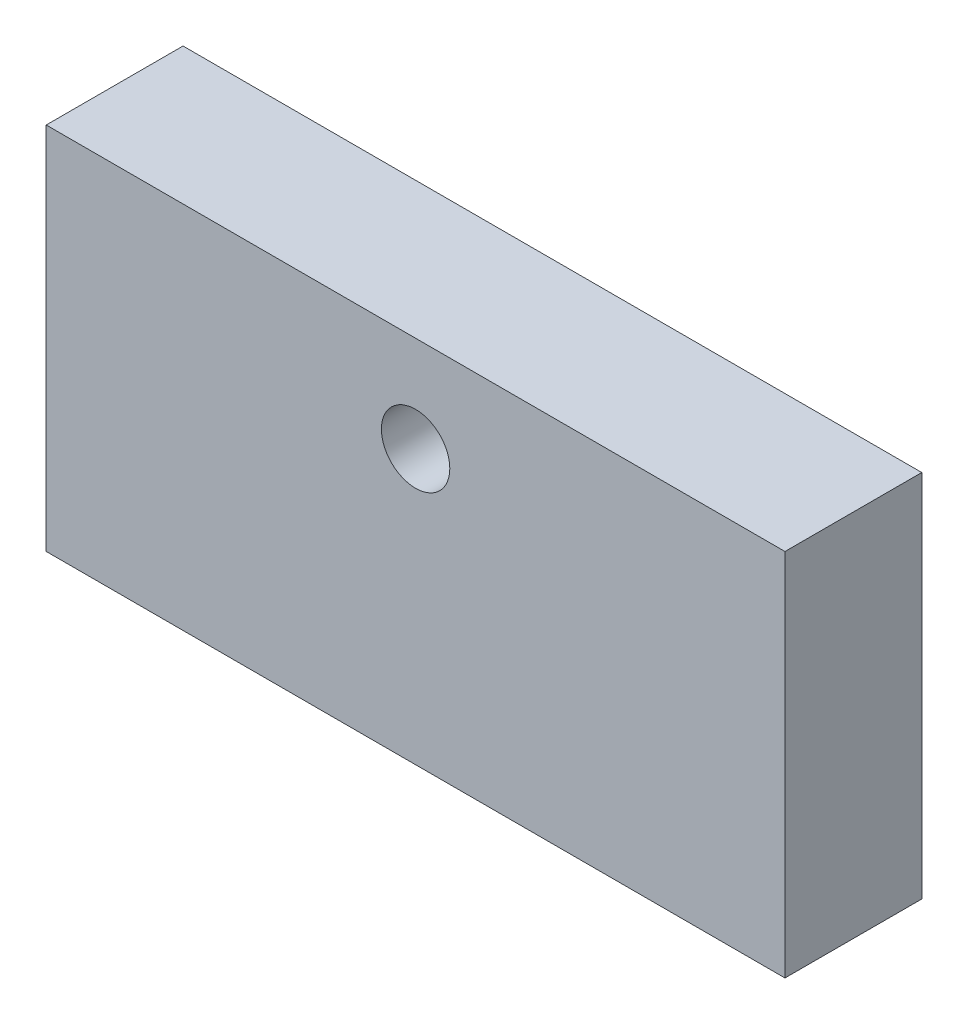
ISO-10303-21;
HEADER;
FILE_DESCRIPTION(('STEP AP214'),'2;1');
FILE_NAME('part.step','',(''),(''),'','','');
FILE_SCHEMA(('AUTOMOTIVE_DESIGN { 1 0 10303 214 1 1 1 1 }'));
ENDSEC;
DATA;
#1=APPLICATION_CONTEXT('core data for automotive mechanical design processes');
#2=APPLICATION_PROTOCOL_DEFINITION('international standard','automotive_design',2000,#1);
#3=PRODUCT_CONTEXT('',#1,'mechanical');
#4=PRODUCT('Part','Part','',(#3));
#5=PRODUCT_RELATED_PRODUCT_CATEGORY('part','',(#4));
#6=PRODUCT_DEFINITION_FORMATION('','',#4);
#7=PRODUCT_DEFINITION_CONTEXT('part definition',#1,'design');
#8=PRODUCT_DEFINITION('design','',#6,#7);
#9=PRODUCT_DEFINITION_SHAPE('','',#8);
#10=(LENGTH_UNIT() NAMED_UNIT(*) SI_UNIT(.MILLI.,.METRE.));
#11=(NAMED_UNIT(*) PLANE_ANGLE_UNIT() SI_UNIT($,.RADIAN.));
#12=(NAMED_UNIT(*) SI_UNIT($,.STERADIAN.) SOLID_ANGLE_UNIT());
#13=UNCERTAINTY_MEASURE_WITH_UNIT(LENGTH_MEASURE(1.E-05),#10,'distance_accuracy_value','');
#14=(GEOMETRIC_REPRESENTATION_CONTEXT(3) GLOBAL_UNCERTAINTY_ASSIGNED_CONTEXT((#13)) GLOBAL_UNIT_ASSIGNED_CONTEXT((#10,
#11,#12)) REPRESENTATION_CONTEXT('',''));
#15=CARTESIAN_POINT('',(0.,0.,0.));
#16=DIRECTION('',(0.,0.,1.));
#17=DIRECTION('',(1.,0.,0.));
#18=AXIS2_PLACEMENT_3D('',#15,#16,#17);
#19=CARTESIAN_POINT('',(0.,0.,10.));
#20=DIRECTION('',(1.,0.,0.));
#21=DIRECTION('',(0.,0.,-1.));
#22=AXIS2_PLACEMENT_3D('',#19,#20,#21);
#23=PLANE('',#22);
#24=DIRECTION('',(0.,-1.,0.));
#25=VECTOR('',#24,1.);
#26=CARTESIAN_POINT('',(0.,0.,0.));
#27=LINE('',#26,#25);
#28=CARTESIAN_POINT('',(0.,27.,0.));
#29=VERTEX_POINT('',#28);
#30=CARTESIAN_POINT('',(0.,0.,0.));
#31=VERTEX_POINT('',#30);
#32=EDGE_CURVE('E96',#29,#31,#27,.T.);
#33=ORIENTED_EDGE('',*,*,#32,.T.);
#34=DIRECTION('',(0.,0.,-1.));
#35=VECTOR('',#34,1.);
#36=CARTESIAN_POINT('',(0.,0.,10.));
#37=LINE('',#36,#35);
#38=CARTESIAN_POINT('',(0.,0.,10.));
#39=VERTEX_POINT('',#38);
#40=EDGE_CURVE('E11',#39,#31,#37,.T.);
#41=ORIENTED_EDGE('',*,*,#40,.F.);
#42=DIRECTION('',(0.,-1.,0.));
#43=VECTOR('',#42,1.);
#44=CARTESIAN_POINT('',(0.,0.,10.));
#45=LINE('',#44,#43);
#46=CARTESIAN_POINT('',(0.,27.,10.));
#47=VERTEX_POINT('',#46);
#48=EDGE_CURVE('E84',#47,#39,#45,.T.);
#49=ORIENTED_EDGE('',*,*,#48,.F.);
#50=DIRECTION('',(0.,0.,-1.));
#51=VECTOR('',#50,1.);
#52=CARTESIAN_POINT('',(0.,27.,10.));
#53=LINE('',#52,#51);
#54=EDGE_CURVE('E92',#47,#29,#53,.T.);
#55=ORIENTED_EDGE('',*,*,#54,.T.);
#56=EDGE_LOOP('',(#33,#41,#49,#55));
#57=FACE_BOUND('',#56,.T.);
#58=ADVANCED_FACE('F33',(#57),#23,.F.);
#59=CARTESIAN_POINT('',(0.,0.,10.));
#60=DIRECTION('',(0.,1.,0.));
#61=DIRECTION('',(0.,0.,1.));
#62=AXIS2_PLACEMENT_3D('',#59,#60,#61);
#63=PLANE('',#62);
#64=DIRECTION('',(1.,0.,0.));
#65=VECTOR('',#64,1.);
#66=CARTESIAN_POINT('',(0.,0.,0.));
#67=LINE('',#66,#65);
#68=CARTESIAN_POINT('',(54.,0.,0.));
#69=VERTEX_POINT('',#68);
#70=EDGE_CURVE('E88',#31,#69,#67,.T.);
#71=ORIENTED_EDGE('',*,*,#70,.T.);
#72=DIRECTION('',(0.,0.,-1.));
#73=VECTOR('',#72,1.);
#74=CARTESIAN_POINT('',(54.,0.,10.));
#75=LINE('',#74,#73);
#76=CARTESIAN_POINT('',(54.,0.,10.));
#77=VERTEX_POINT('',#76);
#78=EDGE_CURVE('E41',#77,#69,#75,.T.);
#79=ORIENTED_EDGE('',*,*,#78,.F.);
#80=DIRECTION('',(1.,0.,0.));
#81=VECTOR('',#80,1.);
#82=CARTESIAN_POINT('',(0.,0.,10.));
#83=LINE('',#82,#81);
#84=EDGE_CURVE('E79',#39,#77,#83,.T.);
#85=ORIENTED_EDGE('',*,*,#84,.F.);
#86=ORIENTED_EDGE('',*,*,#40,.T.);
#87=EDGE_LOOP('',(#71,#79,#85,#86));
#88=FACE_BOUND('',#87,.T.);
#89=ADVANCED_FACE('F87',(#88),#63,.F.);
#90=CARTESIAN_POINT('',(54.,0.,10.));
#91=DIRECTION('',(-1.,0.,0.));
#92=DIRECTION('',(0.,0.,1.));
#93=AXIS2_PLACEMENT_3D('',#90,#91,#92);
#94=PLANE('',#93);
#95=DIRECTION('',(0.,1.,0.));
#96=VECTOR('',#95,1.);
#97=CARTESIAN_POINT('',(54.,0.,0.));
#98=LINE('',#97,#96);
#99=CARTESIAN_POINT('',(54.,27.,0.));
#100=VERTEX_POINT('',#99);
#101=EDGE_CURVE('E66',#69,#100,#98,.T.);
#102=ORIENTED_EDGE('',*,*,#101,.T.);
#103=DIRECTION('',(0.,0.,-1.));
#104=VECTOR('',#103,1.);
#105=CARTESIAN_POINT('',(54.,27.,10.));
#106=LINE('',#105,#104);
#107=CARTESIAN_POINT('',(54.,27.,10.));
#108=VERTEX_POINT('',#107);
#109=EDGE_CURVE('E89',#108,#100,#106,.T.);
#110=ORIENTED_EDGE('',*,*,#109,.F.);
#111=DIRECTION('',(0.,1.,0.));
#112=VECTOR('',#111,1.);
#113=CARTESIAN_POINT('',(54.,0.,10.));
#114=LINE('',#113,#112);
#115=EDGE_CURVE('E82',#77,#108,#114,.T.);
#116=ORIENTED_EDGE('',*,*,#115,.F.);
#117=ORIENTED_EDGE('',*,*,#78,.T.);
#118=EDGE_LOOP('',(#102,#110,#116,#117));
#119=FACE_BOUND('',#118,.T.);
#120=ADVANCED_FACE('F90',(#119),#94,.F.);
#121=CARTESIAN_POINT('',(0.,27.,10.));
#122=DIRECTION('',(0.,-1.,0.));
#123=DIRECTION('',(0.,0.,-1.));
#124=AXIS2_PLACEMENT_3D('',#121,#122,#123);
#125=PLANE('',#124);
#126=DIRECTION('',(-1.,0.,0.));
#127=VECTOR('',#126,1.);
#128=CARTESIAN_POINT('',(0.,27.,0.));
#129=LINE('',#128,#127);
#130=EDGE_CURVE('E72',#100,#29,#129,.T.);
#131=ORIENTED_EDGE('',*,*,#130,.T.);
#132=ORIENTED_EDGE('',*,*,#54,.F.);
#133=DIRECTION('',(-1.,0.,0.));
#134=VECTOR('',#133,1.);
#135=CARTESIAN_POINT('',(0.,27.,10.));
#136=LINE('',#135,#134);
#137=EDGE_CURVE('E49',#108,#47,#136,.T.);
#138=ORIENTED_EDGE('',*,*,#137,.F.);
#139=ORIENTED_EDGE('',*,*,#109,.T.);
#140=EDGE_LOOP('',(#131,#132,#138,#139));
#141=FACE_BOUND('',#140,.T.);
#142=ADVANCED_FACE('F104',(#141),#125,.F.);
#143=CARTESIAN_POINT('',(0.,27.,10.));
#144=DIRECTION('',(0.,0.,-1.));
#145=DIRECTION('',(-1.,0.,0.));
#146=AXIS2_PLACEMENT_3D('',#143,#144,#145);
#147=PLANE('',#146);
#148=CARTESIAN_POINT('',(27.,20.,10.));
#149=DIRECTION('',(0.,0.,1.));
#150=DIRECTION('',(1.,0.,0.));
#151=AXIS2_PLACEMENT_3D('',#148,#149,#150);
#152=CIRCLE('',#151,2.5);
#153=CARTESIAN_POINT('',(29.5,20.,10.));
#154=VERTEX_POINT('',#153);
#155=EDGE_CURVE('E112',#154,#154,#152,.T.);
#156=ORIENTED_EDGE('',*,*,#155,.F.);
#157=EDGE_LOOP('',(#156));
#158=FACE_BOUND('',#157,.T.);
#159=ORIENTED_EDGE('',*,*,#48,.T.);
#160=ORIENTED_EDGE('',*,*,#84,.T.);
#161=ORIENTED_EDGE('',*,*,#115,.T.);
#162=ORIENTED_EDGE('',*,*,#137,.T.);
#163=EDGE_LOOP('',(#159,#160,#161,#162));
#164=FACE_BOUND('',#163,.T.);
#165=ADVANCED_FACE('F80',(#158,#164),#147,.F.);
#166=CARTESIAN_POINT('',(0.,27.,0.));
#167=DIRECTION('',(0.,0.,-1.));
#168=DIRECTION('',(-1.,0.,0.));
#169=AXIS2_PLACEMENT_3D('',#166,#167,#168);
#170=PLANE('',#169);
#171=CARTESIAN_POINT('',(27.,20.,0.));
#172=DIRECTION('',(0.,0.,-1.));
#173=DIRECTION('',(-1.,0.,0.));
#174=AXIS2_PLACEMENT_3D('',#171,#172,#173);
#175=CIRCLE('',#174,2.5);
#176=CARTESIAN_POINT('',(24.5,20.,0.));
#177=VERTEX_POINT('',#176);
#178=EDGE_CURVE('E99',#177,#177,#175,.T.);
#179=ORIENTED_EDGE('',*,*,#178,.F.);
#180=EDGE_LOOP('',(#179));
#181=FACE_BOUND('',#180,.T.);
#182=ORIENTED_EDGE('',*,*,#32,.F.);
#183=ORIENTED_EDGE('',*,*,#130,.F.);
#184=ORIENTED_EDGE('',*,*,#101,.F.);
#185=ORIENTED_EDGE('',*,*,#70,.F.);
#186=EDGE_LOOP('',(#182,#183,#184,#185));
#187=FACE_BOUND('',#186,.T.);
#188=ADVANCED_FACE('F107',(#181,#187),#170,.T.);
#189=CARTESIAN_POINT('',(27.,20.,10.));
#190=DIRECTION('',(0.,0.,1.));
#191=DIRECTION('',(1.,0.,0.));
#192=AXIS2_PLACEMENT_3D('',#189,#190,#191);
#193=CYLINDRICAL_SURFACE('',#192,2.5);
#194=ORIENTED_EDGE('',*,*,#178,.T.);
#195=EDGE_LOOP('',(#194));
#196=FACE_BOUND('',#195,.T.);
#197=ORIENTED_EDGE('',*,*,#155,.T.);
#198=EDGE_LOOP('',(#197));
#199=FACE_BOUND('',#198,.T.);
#200=ADVANCED_FACE('F116',(#196,#199),#193,.F.);
#201=CLOSED_SHELL('',(#58,#89,#120,#142,#165,#188,#200));
#202=MANIFOLD_SOLID_BREP('B2',#201);
#203=ADVANCED_BREP_SHAPE_REPRESENTATION('',(#18,#202),#14);
#204=SHAPE_DEFINITION_REPRESENTATION(#9,#203);
ENDSEC;
END-ISO-10303-21;
